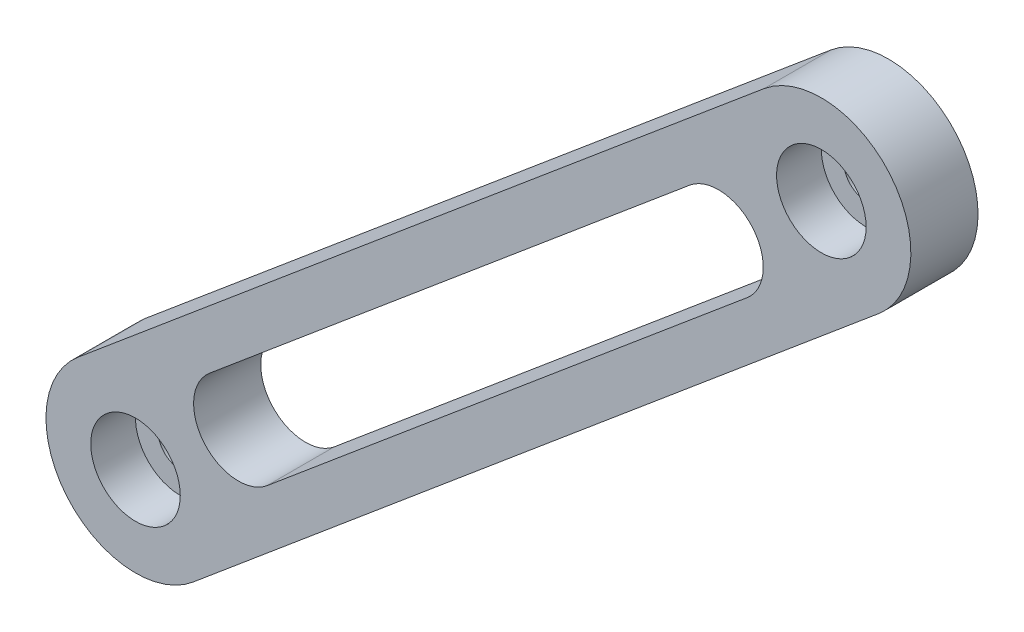
ISO-10303-21;
HEADER;
FILE_DESCRIPTION(('STEP AP214'),'2;1');
FILE_NAME('part.step','',(''),(''),'','','');
FILE_SCHEMA(('AUTOMOTIVE_DESIGN { 1 0 10303 214 1 1 1 1 }'));
ENDSEC;
DATA;
#1=APPLICATION_CONTEXT('core data for automotive mechanical design processes');
#2=APPLICATION_PROTOCOL_DEFINITION('international standard','automotive_design',2000,#1);
#3=PRODUCT_CONTEXT('',#1,'mechanical');
#4=PRODUCT('Part','Part','',(#3));
#5=PRODUCT_RELATED_PRODUCT_CATEGORY('part','',(#4));
#6=PRODUCT_DEFINITION_FORMATION('','',#4);
#7=PRODUCT_DEFINITION_CONTEXT('part definition',#1,'design');
#8=PRODUCT_DEFINITION('design','',#6,#7);
#9=PRODUCT_DEFINITION_SHAPE('','',#8);
#10=(LENGTH_UNIT() NAMED_UNIT(*) SI_UNIT(.MILLI.,.METRE.));
#11=(NAMED_UNIT(*) PLANE_ANGLE_UNIT() SI_UNIT($,.RADIAN.));
#12=(NAMED_UNIT(*) SI_UNIT($,.STERADIAN.) SOLID_ANGLE_UNIT());
#13=UNCERTAINTY_MEASURE_WITH_UNIT(LENGTH_MEASURE(1.E-05),#10,'distance_accuracy_value','');
#14=(GEOMETRIC_REPRESENTATION_CONTEXT(3) GLOBAL_UNCERTAINTY_ASSIGNED_CONTEXT((#13)) GLOBAL_UNIT_ASSIGNED_CONTEXT((#10,
#11,#12)) REPRESENTATION_CONTEXT('',''));
#15=CARTESIAN_POINT('',(0.,0.,0.));
#16=DIRECTION('',(0.,0.,1.));
#17=DIRECTION('',(1.,0.,0.));
#18=AXIS2_PLACEMENT_3D('',#15,#16,#17);
#19=CARTESIAN_POINT('',(476.682680860987,393.18542537645,19.05));
#20=DIRECTION('',(0.,0.,-1.));
#21=DIRECTION('',(-1.,0.,0.));
#22=AXIS2_PLACEMENT_3D('',#19,#20,#21);
#23=CYLINDRICAL_SURFACE('',#22,6.34999999999999);
#24=CARTESIAN_POINT('',(476.682680860987,393.18542537645,0.));
#25=DIRECTION('',(0.,0.,1.));
#26=DIRECTION('',(1.,0.,0.));
#27=AXIS2_PLACEMENT_3D('',#24,#25,#26);
#28=CIRCLE('',#27,6.34999999999999);
#29=CARTESIAN_POINT('',(470.332680860987,393.18542537645,0.));
#30=VERTEX_POINT('',#29);
#31=EDGE_CURVE('E116',#30,#30,#28,.T.);
#32=CARTESIAN_POINT('',(476.682680860987,393.18542537645,6.35));
#33=DIRECTION('',(0.,0.,1.));
#34=DIRECTION('',(1.,0.,0.));
#35=AXIS2_PLACEMENT_3D('',#32,#33,#34);
#36=CIRCLE('',#35,6.34999999999999);
#37=CARTESIAN_POINT('',(470.332680860987,393.18542537645,6.35));
#38=VERTEX_POINT('',#37);
#39=EDGE_CURVE('E37',#38,#38,#36,.T.);
#40=CARTESIAN_POINT('',(470.332680860987,393.18542537645,0.));
#41=CARTESIAN_POINT('',(470.332680860987,393.18542537645,0.0661458333333329));
#42=CARTESIAN_POINT('',(470.332680860987,393.18542537645,0.132291666666666));
#43=CARTESIAN_POINT('',(470.332680860987,393.18542537645,0.264583333333333));
#44=CARTESIAN_POINT('',(470.332680860987,393.18542537645,0.330729166666667));
#45=CARTESIAN_POINT('',(470.332680860987,393.18542537645,0.463020833333334));
#46=CARTESIAN_POINT('',(470.332680860987,393.18542537645,0.529166666666667));
#47=CARTESIAN_POINT('',(470.332680860987,393.18542537645,0.661458333333333));
#48=CARTESIAN_POINT('',(470.332680860987,393.18542537645,0.727604166666666));
#49=CARTESIAN_POINT('',(470.332680860987,393.18542537645,0.859895833333334));
#50=CARTESIAN_POINT('',(470.332680860987,393.18542537645,0.926041666666668));
#51=CARTESIAN_POINT('',(470.332680860987,393.18542537645,1.05833333333333));
#52=CARTESIAN_POINT('',(470.332680860987,393.18542537645,1.12447916666667));
#53=CARTESIAN_POINT('',(470.332680860987,393.18542537645,1.25677083333333));
#54=CARTESIAN_POINT('',(470.332680860987,393.18542537645,1.32291666666667));
#55=CARTESIAN_POINT('',(470.332680860987,393.18542537645,1.45520833333333));
#56=CARTESIAN_POINT('',(470.332680860987,393.18542537645,1.52135416666667));
#57=CARTESIAN_POINT('',(470.332680860987,393.18542537645,1.65364583333333));
#58=CARTESIAN_POINT('',(470.332680860987,393.18542537645,1.71979166666667));
#59=CARTESIAN_POINT('',(470.332680860987,393.18542537645,1.85208333333333));
#60=CARTESIAN_POINT('',(470.332680860987,393.18542537645,1.91822916666667));
#61=CARTESIAN_POINT('',(470.332680860987,393.18542537645,2.05052083333333));
#62=CARTESIAN_POINT('',(470.332680860987,393.18542537645,2.11666666666667));
#63=CARTESIAN_POINT('',(470.332680860987,393.18542537645,2.24895833333333));
#64=CARTESIAN_POINT('',(470.332680860987,393.18542537645,2.31510416666667));
#65=CARTESIAN_POINT('',(470.332680860987,393.18542537645,2.44739583333333));
#66=CARTESIAN_POINT('',(470.332680860987,393.18542537645,2.51354166666667));
#67=CARTESIAN_POINT('',(470.332680860987,393.18542537645,2.64583333333333));
#68=CARTESIAN_POINT('',(470.332680860987,393.18542537645,2.71197916666667));
#69=CARTESIAN_POINT('',(470.332680860987,393.18542537645,2.84427083333333));
#70=CARTESIAN_POINT('',(470.332680860987,393.18542537645,2.91041666666667));
#71=CARTESIAN_POINT('',(470.332680860987,393.18542537645,3.04270833333333));
#72=CARTESIAN_POINT('',(470.332680860987,393.18542537645,3.10885416666667));
#73=CARTESIAN_POINT('',(470.332680860987,393.18542537645,3.24114583333333));
#74=CARTESIAN_POINT('',(470.332680860987,393.18542537645,3.30729166666667));
#75=CARTESIAN_POINT('',(470.332680860987,393.18542537645,3.43958333333333));
#76=CARTESIAN_POINT('',(470.332680860987,393.18542537645,3.50572916666667));
#77=CARTESIAN_POINT('',(470.332680860987,393.18542537645,3.63802083333333));
#78=CARTESIAN_POINT('',(470.332680860987,393.18542537645,3.70416666666667));
#79=CARTESIAN_POINT('',(470.332680860987,393.18542537645,3.83645833333333));
#80=CARTESIAN_POINT('',(470.332680860987,393.18542537645,3.90260416666667));
#81=CARTESIAN_POINT('',(470.332680860987,393.18542537645,4.03489583333333));
#82=CARTESIAN_POINT('',(470.332680860987,393.18542537645,4.10104166666667));
#83=CARTESIAN_POINT('',(470.332680860987,393.18542537645,4.23333333333333));
#84=CARTESIAN_POINT('',(470.332680860987,393.18542537645,4.29947916666667));
#85=CARTESIAN_POINT('',(470.332680860987,393.18542537645,4.43177083333333));
#86=CARTESIAN_POINT('',(470.332680860987,393.18542537645,4.49791666666667));
#87=CARTESIAN_POINT('',(470.332680860987,393.18542537645,4.63020833333333));
#88=CARTESIAN_POINT('',(470.332680860987,393.18542537645,4.69635416666667));
#89=CARTESIAN_POINT('',(470.332680860987,393.18542537645,4.82864583333333));
#90=CARTESIAN_POINT('',(470.332680860987,393.18542537645,4.89479166666667));
#91=CARTESIAN_POINT('',(470.332680860987,393.18542537645,5.02708333333333));
#92=CARTESIAN_POINT('',(470.332680860987,393.18542537645,5.09322916666667));
#93=CARTESIAN_POINT('',(470.332680860987,393.18542537645,5.22552083333333));
#94=CARTESIAN_POINT('',(470.332680860987,393.18542537645,5.29166666666667));
#95=CARTESIAN_POINT('',(470.332680860987,393.18542537645,5.42395833333333));
#96=CARTESIAN_POINT('',(470.332680860987,393.18542537645,5.49010416666667));
#97=CARTESIAN_POINT('',(470.332680860987,393.18542537645,5.62239583333333));
#98=CARTESIAN_POINT('',(470.332680860987,393.18542537645,5.68854166666667));
#99=CARTESIAN_POINT('',(470.332680860987,393.18542537645,5.82083333333333));
#100=CARTESIAN_POINT('',(470.332680860987,393.18542537645,5.88697916666667));
#101=CARTESIAN_POINT('',(470.332680860987,393.18542537645,6.01927083333333));
#102=CARTESIAN_POINT('',(470.332680860987,393.18542537645,6.08541666666667));
#103=CARTESIAN_POINT('',(470.332680860987,393.18542537645,6.21770833333333));
#104=CARTESIAN_POINT('',(470.332680860987,393.18542537645,6.28385416666667));
#105=CARTESIAN_POINT('',(470.332680860987,393.18542537645,6.35));
#106=B_SPLINE_CURVE_WITH_KNOTS('',3,(#40,#41,#42,#43,#44,#45,#46,#47,#48,#49,#50,#51,#52,#53,
#54,#55,#56,#57,#58,#59,#60,#61,#62,#63,#64,#65,#66,#67,#68,#69,#70,#71,#72,#73,#74,#75,#76,#77,
#78,#79,#80,#81,#82,#83,#84,#85,#86,#87,#88,#89,#90,#91,#92,#93,#94,#95,#96,#97,#98,#99,#100,
#101,#102,#103,#104,#105),.UNSPECIFIED.,.F.,.F.,(4,2,2,2,2,2,2,2,2,2,2,2,2,2,2,2,2,2,2,2,2,2,2,
2,2,2,2,2,2,2,2,2,4),(0.,0.198437499999999,0.396875000000001,0.5953125,0.793749999999999,
0.992187500000002,1.190625,1.3890625,1.5875,1.7859375,1.984375,2.1828125,2.38125,2.5796875,
2.778125,2.9765625,3.175,3.3734375,3.571875,3.7703125,3.96875,4.1671875,4.365625,4.5640625,
4.7625,4.9609375,5.159375,5.3578125,5.55625,5.7546875,5.953125,6.1515625,6.35),.UNSPECIFIED.);
#107=EDGE_CURVE('BSEAM33',#30,#38,#106,.T.);
#108=ORIENTED_EDGE('',*,*,#31,.F.);
#109=ORIENTED_EDGE('',*,*,#39,.T.);
#110=ORIENTED_EDGE('',*,*,#107,.T.);
#111=ORIENTED_EDGE('',*,*,#107,.F.);
#112=EDGE_LOOP('',(#108,#110,#109,#111));
#113=FACE_BOUND('',#112,.T.);
#114=ADVANCED_FACE('F33',(#113),#23,.F.);
#115=CARTESIAN_POINT('',(282.107391364424,229.917371723671,19.05));
#116=DIRECTION('',(0.,0.,-1.));
#117=DIRECTION('',(-1.,0.,0.));
#118=AXIS2_PLACEMENT_3D('',#115,#116,#117);
#119=CYLINDRICAL_SURFACE('',#118,6.34999999999988);
#120=CARTESIAN_POINT('',(282.107391364424,229.917371723671,0.));
#121=DIRECTION('',(0.,0.,1.));
#122=DIRECTION('',(1.,0.,0.));
#123=AXIS2_PLACEMENT_3D('',#120,#121,#122);
#124=CIRCLE('',#123,6.34999999999988);
#125=CARTESIAN_POINT('',(275.757391364425,229.917371723671,0.));
#126=VERTEX_POINT('',#125);
#127=EDGE_CURVE('E130',#126,#126,#124,.T.);
#128=CARTESIAN_POINT('',(282.107391364424,229.917371723671,6.35));
#129=DIRECTION('',(0.,0.,1.));
#130=DIRECTION('',(1.,0.,0.));
#131=AXIS2_PLACEMENT_3D('',#128,#129,#130);
#132=CIRCLE('',#131,6.34999999999988);
#133=CARTESIAN_POINT('',(275.757391364425,229.917371723671,6.35));
#134=VERTEX_POINT('',#133);
#135=EDGE_CURVE('E167',#134,#134,#132,.T.);
#136=CARTESIAN_POINT('',(275.757391364425,229.917371723671,0.));
#137=CARTESIAN_POINT('',(275.757391364425,229.917371723671,0.0661458333333329));
#138=CARTESIAN_POINT('',(275.757391364425,229.917371723671,0.132291666666666));
#139=CARTESIAN_POINT('',(275.757391364425,229.917371723671,0.264583333333333));
#140=CARTESIAN_POINT('',(275.757391364425,229.917371723671,0.330729166666667));
#141=CARTESIAN_POINT('',(275.757391364425,229.917371723671,0.463020833333334));
#142=CARTESIAN_POINT('',(275.757391364425,229.917371723671,0.529166666666667));
#143=CARTESIAN_POINT('',(275.757391364425,229.917371723671,0.661458333333333));
#144=CARTESIAN_POINT('',(275.757391364425,229.917371723671,0.727604166666666));
#145=CARTESIAN_POINT('',(275.757391364425,229.917371723671,0.859895833333334));
#146=CARTESIAN_POINT('',(275.757391364425,229.917371723671,0.926041666666668));
#147=CARTESIAN_POINT('',(275.757391364425,229.917371723671,1.05833333333333));
#148=CARTESIAN_POINT('',(275.757391364425,229.917371723671,1.12447916666667));
#149=CARTESIAN_POINT('',(275.757391364425,229.917371723671,1.25677083333333));
#150=CARTESIAN_POINT('',(275.757391364425,229.917371723671,1.32291666666667));
#151=CARTESIAN_POINT('',(275.757391364425,229.917371723671,1.45520833333333));
#152=CARTESIAN_POINT('',(275.757391364425,229.917371723671,1.52135416666667));
#153=CARTESIAN_POINT('',(275.757391364425,229.917371723671,1.65364583333333));
#154=CARTESIAN_POINT('',(275.757391364425,229.917371723671,1.71979166666667));
#155=CARTESIAN_POINT('',(275.757391364425,229.917371723671,1.85208333333333));
#156=CARTESIAN_POINT('',(275.757391364425,229.917371723671,1.91822916666667));
#157=CARTESIAN_POINT('',(275.757391364425,229.917371723671,2.05052083333333));
#158=CARTESIAN_POINT('',(275.757391364425,229.917371723671,2.11666666666667));
#159=CARTESIAN_POINT('',(275.757391364425,229.917371723671,2.24895833333333));
#160=CARTESIAN_POINT('',(275.757391364425,229.917371723671,2.31510416666667));
#161=CARTESIAN_POINT('',(275.757391364425,229.917371723671,2.44739583333333));
#162=CARTESIAN_POINT('',(275.757391364425,229.917371723671,2.51354166666667));
#163=CARTESIAN_POINT('',(275.757391364425,229.917371723671,2.64583333333333));
#164=CARTESIAN_POINT('',(275.757391364425,229.917371723671,2.71197916666667));
#165=CARTESIAN_POINT('',(275.757391364425,229.917371723671,2.84427083333333));
#166=CARTESIAN_POINT('',(275.757391364425,229.917371723671,2.91041666666667));
#167=CARTESIAN_POINT('',(275.757391364425,229.917371723671,3.04270833333333));
#168=CARTESIAN_POINT('',(275.757391364425,229.917371723671,3.10885416666667));
#169=CARTESIAN_POINT('',(275.757391364425,229.917371723671,3.24114583333333));
#170=CARTESIAN_POINT('',(275.757391364425,229.917371723671,3.30729166666667));
#171=CARTESIAN_POINT('',(275.757391364425,229.917371723671,3.43958333333333));
#172=CARTESIAN_POINT('',(275.757391364425,229.917371723671,3.50572916666667));
#173=CARTESIAN_POINT('',(275.757391364425,229.917371723671,3.63802083333333));
#174=CARTESIAN_POINT('',(275.757391364425,229.917371723671,3.70416666666667));
#175=CARTESIAN_POINT('',(275.757391364425,229.917371723671,3.83645833333333));
#176=CARTESIAN_POINT('',(275.757391364425,229.917371723671,3.90260416666667));
#177=CARTESIAN_POINT('',(275.757391364425,229.917371723671,4.03489583333333));
#178=CARTESIAN_POINT('',(275.757391364425,229.917371723671,4.10104166666667));
#179=CARTESIAN_POINT('',(275.757391364425,229.917371723671,4.23333333333333));
#180=CARTESIAN_POINT('',(275.757391364425,229.917371723671,4.29947916666667));
#181=CARTESIAN_POINT('',(275.757391364425,229.917371723671,4.43177083333333));
#182=CARTESIAN_POINT('',(275.757391364425,229.917371723671,4.49791666666667));
#183=CARTESIAN_POINT('',(275.757391364425,229.917371723671,4.63020833333333));
#184=CARTESIAN_POINT('',(275.757391364425,229.917371723671,4.69635416666667));
#185=CARTESIAN_POINT('',(275.757391364425,229.917371723671,4.82864583333333));
#186=CARTESIAN_POINT('',(275.757391364425,229.917371723671,4.89479166666667));
#187=CARTESIAN_POINT('',(275.757391364425,229.917371723671,5.02708333333333));
#188=CARTESIAN_POINT('',(275.757391364425,229.917371723671,5.09322916666667));
#189=CARTESIAN_POINT('',(275.757391364425,229.917371723671,5.22552083333333));
#190=CARTESIAN_POINT('',(275.757391364425,229.917371723671,5.29166666666667));
#191=CARTESIAN_POINT('',(275.757391364425,229.917371723671,5.42395833333333));
#192=CARTESIAN_POINT('',(275.757391364425,229.917371723671,5.49010416666667));
#193=CARTESIAN_POINT('',(275.757391364425,229.917371723671,5.62239583333333));
#194=CARTESIAN_POINT('',(275.757391364425,229.917371723671,5.68854166666667));
#195=CARTESIAN_POINT('',(275.757391364425,229.917371723671,5.82083333333333));
#196=CARTESIAN_POINT('',(275.757391364425,229.917371723671,5.88697916666667));
#197=CARTESIAN_POINT('',(275.757391364425,229.917371723671,6.01927083333333));
#198=CARTESIAN_POINT('',(275.757391364425,229.917371723671,6.08541666666667));
#199=CARTESIAN_POINT('',(275.757391364425,229.917371723671,6.21770833333333));
#200=CARTESIAN_POINT('',(275.757391364425,229.917371723671,6.28385416666667));
#201=CARTESIAN_POINT('',(275.757391364425,229.917371723671,6.35));
#202=B_SPLINE_CURVE_WITH_KNOTS('',3,(#136,#137,#138,#139,#140,#141,#142,#143,#144,#145,#146,
#147,#148,#149,#150,#151,#152,#153,#154,#155,#156,#157,#158,#159,#160,#161,#162,#163,#164,#165,
#166,#167,#168,#169,#170,#171,#172,#173,#174,#175,#176,#177,#178,#179,#180,#181,#182,#183,#184,
#185,#186,#187,#188,#189,#190,#191,#192,#193,#194,#195,#196,#197,#198,#199,#200,#201),
.UNSPECIFIED.,.F.,.F.,(4,2,2,2,2,2,2,2,2,2,2,2,2,2,2,2,2,2,2,2,2,2,2,2,2,2,2,2,2,2,2,2,4),(0.,
0.198437499999999,0.396875000000001,0.5953125,0.793749999999999,0.992187500000002,1.190625,
1.3890625,1.5875,1.7859375,1.984375,2.1828125,2.38125,2.5796875,2.778125,2.9765625,3.175,
3.3734375,3.571875,3.7703125,3.96875,4.1671875,4.365625,4.5640625,4.7625,4.9609375,5.159375,
5.3578125,5.55625,5.7546875,5.953125,6.1515625,6.35),.UNSPECIFIED.);
#203=EDGE_CURVE('BSEAM191',#126,#134,#202,.T.);
#204=ORIENTED_EDGE('',*,*,#127,.F.);
#205=ORIENTED_EDGE('',*,*,#135,.T.);
#206=ORIENTED_EDGE('',*,*,#203,.T.);
#207=ORIENTED_EDGE('',*,*,#203,.F.);
#208=EDGE_LOOP('',(#204,#206,#205,#207));
#209=FACE_BOUND('',#208,.T.);
#210=ADVANCED_FACE('F191',(#209),#119,.F.);
#211=CARTESIAN_POINT('',(282.107392308767,229.917372516069,19.05));
#212=DIRECTION('',(0.,0.,1.));
#213=DIRECTION('',(1.,0.,0.));
#214=AXIS2_PLACEMENT_3D('',#211,#212,#213);
#215=PLANE('',#214);
#216=CARTESIAN_POINT('',(282.107391364424,229.917371723671,19.05));
#217=DIRECTION('',(0.,0.,1.));
#218=DIRECTION('',(1.,0.,0.));
#219=AXIS2_PLACEMENT_3D('',#216,#217,#218);
#220=CIRCLE('',#219,12.7);
#221=CARTESIAN_POINT('',(294.807391364424,229.917371723671,19.05));
#222=VERTEX_POINT('',#221);
#223=EDGE_CURVE('E174',#222,#222,#220,.T.);
#224=ORIENTED_EDGE('',*,*,#223,.F.);
#225=EDGE_LOOP('',(#224));
#226=FACE_BOUND('',#225,.T.);
#227=CARTESIAN_POINT('',(476.682680860987,393.18542537645,19.05));
#228=DIRECTION('',(0.,0.,1.));
#229=DIRECTION('',(1.,0.,0.));
#230=AXIS2_PLACEMENT_3D('',#227,#228,#229);
#231=CIRCLE('',#230,12.7);
#232=CARTESIAN_POINT('',(489.382680860987,393.18542537645,19.05));
#233=VERTEX_POINT('',#232);
#234=EDGE_CURVE('E184',#233,#233,#231,.T.);
#235=ORIENTED_EDGE('',*,*,#234,.F.);
#236=EDGE_LOOP('',(#235));
#237=FACE_BOUND('',#236,.T.);
#238=DIRECTION('',(-0.766044443118976,-0.642787609686541,0.));
#239=VECTOR('',#238,1.);
#240=CARTESIAN_POINT('',(439.332984935135,378.423981875004,19.05));
#241=LINE('',#240,#239);
#242=CARTESIAN_POINT('',(439.332984935135,378.423981875004,19.05));
#243=VERTEX_POINT('',#242);
#244=CARTESIAN_POINT('',(303.130282948581,264.136344872737,19.05));
#245=VERTEX_POINT('',#244);
#246=EDGE_CURVE('E108',#243,#245,#241,.T.);
#247=ORIENTED_EDGE('',*,*,#246,.F.);
#248=CARTESIAN_POINT('',(447.496387578154,368.695217447393,19.05));
#249=DIRECTION('',(0.,0.,1.));
#250=DIRECTION('',(1.,0.,0.));
#251=AXIS2_PLACEMENT_3D('',#248,#249,#250);
#252=CIRCLE('',#251,12.7);
#253=CARTESIAN_POINT('',(455.659790221174,358.966453019782,19.05));
#254=VERTEX_POINT('',#253);
#255=EDGE_CURVE('E100',#254,#243,#252,.T.);
#256=ORIENTED_EDGE('',*,*,#255,.F.);
#257=DIRECTION('',(0.766044443118977,0.642787609686541,0.));
#258=VECTOR('',#257,1.);
#259=CARTESIAN_POINT('',(455.659790221174,358.966453019782,19.05));
#260=LINE('',#259,#258);
#261=CARTESIAN_POINT('',(319.45708823462,244.678816017515,19.05));
#262=VERTEX_POINT('',#261);
#263=EDGE_CURVE('E124',#262,#254,#260,.T.);
#264=ORIENTED_EDGE('',*,*,#263,.F.);
#265=CARTESIAN_POINT('',(311.2936855916,254.407580445126,19.05));
#266=DIRECTION('',(0.,0.,1.));
#267=DIRECTION('',(1.,0.,0.));
#268=AXIS2_PLACEMENT_3D('',#265,#266,#267);
#269=CIRCLE('',#268,12.7);
#270=EDGE_CURVE('E122',#245,#262,#269,.T.);
#271=ORIENTED_EDGE('',*,*,#270,.F.);
#272=EDGE_LOOP('',(#247,#256,#264,#271));
#273=FACE_BOUND('',#272,.T.);
#274=CARTESIAN_POINT('',(282.107392308767,229.917372516069,19.05));
#275=DIRECTION('',(0.,0.,1.));
#276=DIRECTION('',(1.,0.,0.));
#277=AXIS2_PLACEMENT_3D('',#274,#275,#276);
#278=CIRCLE('',#277,25.4000000000003);
#279=CARTESIAN_POINT('',(265.780587022729,249.374901371292,19.05));
#280=VERTEX_POINT('',#279);
#281=CARTESIAN_POINT('',(298.434195706119,210.459842076052,19.05));
#282=VERTEX_POINT('',#281);
#283=EDGE_CURVE('E143',#280,#282,#278,.T.);
#284=ORIENTED_EDGE('',*,*,#283,.T.);
#285=DIRECTION('',(0.766044443118977,0.64278760968654,0.));
#286=VECTOR('',#285,1.);
#287=CARTESIAN_POINT('',(493.009486147026,373.727896521228,19.05));
#288=LINE('',#287,#286);
#289=CARTESIAN_POINT('',(493.009486147026,373.727896521228,19.05));
#290=VERTEX_POINT('',#289);
#291=EDGE_CURVE('E146',#282,#290,#288,.T.);
#292=ORIENTED_EDGE('',*,*,#291,.T.);
#293=CARTESIAN_POINT('',(476.682680860987,393.18542537645,19.05));
#294=DIRECTION('',(0.,0.,1.));
#295=DIRECTION('',(-1.,0.,0.));
#296=AXIS2_PLACEMENT_3D('',#293,#294,#295);
#297=CIRCLE('',#296,25.4000000000001);
#298=CARTESIAN_POINT('',(460.355875574949,412.642954231673,19.05));
#299=VERTEX_POINT('',#298);
#300=EDGE_CURVE('E149',#290,#299,#297,.T.);
#301=ORIENTED_EDGE('',*,*,#300,.T.);
#302=DIRECTION('',(-0.766044443118978,-0.642787609686539,0.));
#303=VECTOR('',#302,1.);
#304=CARTESIAN_POINT('',(460.355875574949,412.642954231673,19.05));
#305=LINE('',#304,#303);
#306=EDGE_CURVE('E151',#299,#280,#305,.T.);
#307=ORIENTED_EDGE('',*,*,#306,.T.);
#308=EDGE_LOOP('',(#284,#292,#301,#307));
#309=FACE_BOUND('',#308,.T.);
#310=ADVANCED_FACE('F120',(#226,#237,#273,#309),#215,.T.);
#311=CARTESIAN_POINT('',(282.107392308767,229.917372516069,0.));
#312=DIRECTION('',(0.,0.,1.));
#313=DIRECTION('',(1.,0.,0.));
#314=AXIS2_PLACEMENT_3D('',#311,#312,#313);
#315=PLANE('',#314);
#316=ORIENTED_EDGE('',*,*,#31,.T.);
#317=EDGE_LOOP('',(#316));
#318=FACE_BOUND('',#317,.T.);
#319=CARTESIAN_POINT('',(282.107392308767,229.917372516069,0.));
#320=DIRECTION('',(0.,0.,1.));
#321=DIRECTION('',(1.,0.,0.));
#322=AXIS2_PLACEMENT_3D('',#319,#320,#321);
#323=CIRCLE('',#322,25.4000000000003);
#324=CARTESIAN_POINT('',(265.780587022729,249.374901371292,0.));
#325=VERTEX_POINT('',#324);
#326=CARTESIAN_POINT('',(298.434195706119,210.459842076052,0.));
#327=VERTEX_POINT('',#326);
#328=EDGE_CURVE('E142',#325,#327,#323,.T.);
#329=ORIENTED_EDGE('',*,*,#328,.F.);
#330=DIRECTION('',(-0.766044443118978,-0.642787609686539,0.));
#331=VECTOR('',#330,1.);
#332=CARTESIAN_POINT('',(460.355875574949,412.642954231673,0.));
#333=LINE('',#332,#331);
#334=CARTESIAN_POINT('',(460.355875574949,412.642954231673,0.));
#335=VERTEX_POINT('',#334);
#336=EDGE_CURVE('E147',#335,#325,#333,.T.);
#337=ORIENTED_EDGE('',*,*,#336,.F.);
#338=CARTESIAN_POINT('',(476.682680860987,393.18542537645,0.));
#339=DIRECTION('',(0.,0.,1.));
#340=DIRECTION('',(-1.,0.,0.));
#341=AXIS2_PLACEMENT_3D('',#338,#339,#340);
#342=CIRCLE('',#341,25.4000000000001);
#343=CARTESIAN_POINT('',(493.009486147026,373.727896521228,0.));
#344=VERTEX_POINT('',#343);
#345=EDGE_CURVE('E158',#344,#335,#342,.T.);
#346=ORIENTED_EDGE('',*,*,#345,.F.);
#347=DIRECTION('',(0.766044443118977,0.64278760968654,0.));
#348=VECTOR('',#347,1.);
#349=CARTESIAN_POINT('',(493.009486147026,373.727896521228,0.));
#350=LINE('',#349,#348);
#351=EDGE_CURVE('E156',#327,#344,#350,.T.);
#352=ORIENTED_EDGE('',*,*,#351,.F.);
#353=EDGE_LOOP('',(#329,#337,#346,#352));
#354=FACE_BOUND('',#353,.T.);
#355=CARTESIAN_POINT('',(447.496387578154,368.695217447393,0.));
#356=DIRECTION('',(0.,0.,1.));
#357=DIRECTION('',(1.,0.,0.));
#358=AXIS2_PLACEMENT_3D('',#355,#356,#357);
#359=CIRCLE('',#358,12.7);
#360=CARTESIAN_POINT('',(455.659790221174,358.966453019782,0.));
#361=VERTEX_POINT('',#360);
#362=CARTESIAN_POINT('',(439.332984935135,378.423981875004,0.));
#363=VERTEX_POINT('',#362);
#364=EDGE_CURVE('E58',#361,#363,#359,.T.);
#365=ORIENTED_EDGE('',*,*,#364,.T.);
#366=DIRECTION('',(-0.766044443118976,-0.642787609686541,0.));
#367=VECTOR('',#366,1.);
#368=CARTESIAN_POINT('',(439.332984935135,378.423981875004,0.));
#369=LINE('',#368,#367);
#370=CARTESIAN_POINT('',(303.130282948581,264.136344872737,0.));
#371=VERTEX_POINT('',#370);
#372=EDGE_CURVE('E115',#363,#371,#369,.T.);
#373=ORIENTED_EDGE('',*,*,#372,.T.);
#374=CARTESIAN_POINT('',(311.2936855916,254.407580445126,0.));
#375=DIRECTION('',(0.,0.,1.));
#376=DIRECTION('',(1.,0.,0.));
#377=AXIS2_PLACEMENT_3D('',#374,#375,#376);
#378=CIRCLE('',#377,12.7);
#379=CARTESIAN_POINT('',(319.45708823462,244.678816017515,0.));
#380=VERTEX_POINT('',#379);
#381=EDGE_CURVE('E132',#371,#380,#378,.T.);
#382=ORIENTED_EDGE('',*,*,#381,.T.);
#383=DIRECTION('',(0.766044443118977,0.642787609686541,0.));
#384=VECTOR('',#383,1.);
#385=CARTESIAN_POINT('',(455.659790221174,358.966453019782,0.));
#386=LINE('',#385,#384);
#387=EDGE_CURVE('E109',#380,#361,#386,.T.);
#388=ORIENTED_EDGE('',*,*,#387,.T.);
#389=EDGE_LOOP('',(#365,#373,#382,#388));
#390=FACE_BOUND('',#389,.T.);
#391=ORIENTED_EDGE('',*,*,#127,.T.);
#392=EDGE_LOOP('',(#391));
#393=FACE_BOUND('',#392,.T.);
#394=ADVANCED_FACE('F189',(#318,#354,#390,#393),#315,.F.);
#395=CARTESIAN_POINT('',(282.107392308767,229.917372516069,19.05));
#396=DIRECTION('',(0.,0.,-1.));
#397=DIRECTION('',(-1.,0.,0.));
#398=AXIS2_PLACEMENT_3D('',#395,#396,#397);
#399=CYLINDRICAL_SURFACE('',#398,25.4000000000003);
#400=ORIENTED_EDGE('',*,*,#328,.T.);
#401=DIRECTION('',(0.,0.,-1.));
#402=VECTOR('',#401,1.);
#403=CARTESIAN_POINT('',(298.434195706119,210.459842076052,19.05));
#404=LINE('',#403,#402);
#405=EDGE_CURVE('E11',#282,#327,#404,.T.);
#406=ORIENTED_EDGE('',*,*,#405,.F.);
#407=ORIENTED_EDGE('',*,*,#283,.F.);
#408=DIRECTION('',(0.,0.,-1.));
#409=VECTOR('',#408,1.);
#410=CARTESIAN_POINT('',(265.780587022729,249.374901371292,19.05));
#411=LINE('',#410,#409);
#412=EDGE_CURVE('E153',#280,#325,#411,.T.);
#413=ORIENTED_EDGE('',*,*,#412,.T.);
#414=EDGE_LOOP('',(#400,#406,#407,#413));
#415=FACE_BOUND('',#414,.T.);
#416=ADVANCED_FACE('F35',(#415),#399,.T.);
#417=CARTESIAN_POINT('',(493.009486147026,373.727896521228,19.05));
#418=DIRECTION('',(-0.64278760968654,0.766044443118978,0.));
#419=DIRECTION('',(-0.766044443118978,-0.64278760968654,0.));
#420=AXIS2_PLACEMENT_3D('',#417,#418,#419);
#421=PLANE('',#420);
#422=ORIENTED_EDGE('',*,*,#351,.T.);
#423=DIRECTION('',(0.,0.,-1.));
#424=VECTOR('',#423,1.);
#425=CARTESIAN_POINT('',(493.009486147026,373.727896521228,19.05));
#426=LINE('',#425,#424);
#427=EDGE_CURVE('E42',#290,#344,#426,.T.);
#428=ORIENTED_EDGE('',*,*,#427,.F.);
#429=ORIENTED_EDGE('',*,*,#291,.F.);
#430=ORIENTED_EDGE('',*,*,#405,.T.);
#431=EDGE_LOOP('',(#422,#428,#429,#430));
#432=FACE_BOUND('',#431,.T.);
#433=ADVANCED_FACE('F227',(#432),#421,.F.);
#434=CARTESIAN_POINT('',(476.682680860987,393.18542537645,19.05));
#435=DIRECTION('',(0.,0.,-1.));
#436=DIRECTION('',(-1.,0.,0.));
#437=AXIS2_PLACEMENT_3D('',#434,#435,#436);
#438=CYLINDRICAL_SURFACE('',#437,25.4000000000001);
#439=ORIENTED_EDGE('',*,*,#345,.T.);
#440=DIRECTION('',(0.,0.,-1.));
#441=VECTOR('',#440,1.);
#442=CARTESIAN_POINT('',(460.355875574949,412.642954231673,19.05));
#443=LINE('',#442,#441);
#444=EDGE_CURVE('E163',#299,#335,#443,.T.);
#445=ORIENTED_EDGE('',*,*,#444,.F.);
#446=ORIENTED_EDGE('',*,*,#300,.F.);
#447=ORIENTED_EDGE('',*,*,#427,.T.);
#448=EDGE_LOOP('',(#439,#445,#446,#447));
#449=FACE_BOUND('',#448,.T.);
#450=ADVANCED_FACE('F224',(#449),#438,.T.);
#451=CARTESIAN_POINT('',(460.355875574949,412.642954231673,19.05));
#452=DIRECTION('',(0.642787609686539,-0.766044443118978,0.));
#453=DIRECTION('',(0.766044443118978,0.642787609686539,0.));
#454=AXIS2_PLACEMENT_3D('',#451,#452,#453);
#455=PLANE('',#454);
#456=ORIENTED_EDGE('',*,*,#336,.T.);
#457=ORIENTED_EDGE('',*,*,#412,.F.);
#458=ORIENTED_EDGE('',*,*,#306,.F.);
#459=ORIENTED_EDGE('',*,*,#444,.T.);
#460=EDGE_LOOP('',(#456,#457,#458,#459));
#461=FACE_BOUND('',#460,.T.);
#462=ADVANCED_FACE('F217',(#461),#455,.F.);
#463=CARTESIAN_POINT('',(447.496387578154,368.695217447393,19.05));
#464=DIRECTION('',(0.,0.,-1.));
#465=DIRECTION('',(-1.,0.,0.));
#466=AXIS2_PLACEMENT_3D('',#463,#464,#465);
#467=CYLINDRICAL_SURFACE('',#466,12.7);
#468=ORIENTED_EDGE('',*,*,#364,.F.);
#469=DIRECTION('',(0.,0.,-1.));
#470=VECTOR('',#469,1.);
#471=CARTESIAN_POINT('',(455.659790221174,358.966453019782,19.05));
#472=LINE('',#471,#470);
#473=EDGE_CURVE('E104',#254,#361,#472,.T.);
#474=ORIENTED_EDGE('',*,*,#473,.F.);
#475=ORIENTED_EDGE('',*,*,#255,.T.);
#476=DIRECTION('',(0.,0.,-1.));
#477=VECTOR('',#476,1.);
#478=CARTESIAN_POINT('',(439.332984935135,378.423981875004,19.05));
#479=LINE('',#478,#477);
#480=EDGE_CURVE('E103',#243,#363,#479,.T.);
#481=ORIENTED_EDGE('',*,*,#480,.T.);
#482=EDGE_LOOP('',(#468,#474,#475,#481));
#483=FACE_BOUND('',#482,.T.);
#484=ADVANCED_FACE('F102',(#483),#467,.F.);
#485=CARTESIAN_POINT('',(439.332984935135,378.423981875004,19.05));
#486=DIRECTION('',(0.642787609686541,-0.766044443118976,0.));
#487=DIRECTION('',(0.766044443118976,0.642787609686541,0.));
#488=AXIS2_PLACEMENT_3D('',#485,#486,#487);
#489=PLANE('',#488);
#490=ORIENTED_EDGE('',*,*,#372,.F.);
#491=ORIENTED_EDGE('',*,*,#480,.F.);
#492=ORIENTED_EDGE('',*,*,#246,.T.);
#493=DIRECTION('',(0.,0.,-1.));
#494=VECTOR('',#493,1.);
#495=CARTESIAN_POINT('',(303.130282948581,264.136344872737,19.05));
#496=LINE('',#495,#494);
#497=EDGE_CURVE('E117',#245,#371,#496,.T.);
#498=ORIENTED_EDGE('',*,*,#497,.T.);
#499=EDGE_LOOP('',(#490,#491,#492,#498));
#500=FACE_BOUND('',#499,.T.);
#501=ADVANCED_FACE('F112',(#500),#489,.T.);
#502=CARTESIAN_POINT('',(311.2936855916,254.407580445126,19.05));
#503=DIRECTION('',(0.,0.,-1.));
#504=DIRECTION('',(-1.,0.,0.));
#505=AXIS2_PLACEMENT_3D('',#502,#503,#504);
#506=CYLINDRICAL_SURFACE('',#505,12.7);
#507=ORIENTED_EDGE('',*,*,#381,.F.);
#508=ORIENTED_EDGE('',*,*,#497,.F.);
#509=ORIENTED_EDGE('',*,*,#270,.T.);
#510=DIRECTION('',(0.,0.,-1.));
#511=VECTOR('',#510,1.);
#512=CARTESIAN_POINT('',(319.45708823462,244.678816017515,19.05));
#513=LINE('',#512,#511);
#514=EDGE_CURVE('E50',#262,#380,#513,.T.);
#515=ORIENTED_EDGE('',*,*,#514,.T.);
#516=EDGE_LOOP('',(#507,#508,#509,#515));
#517=FACE_BOUND('',#516,.T.);
#518=ADVANCED_FACE('F210',(#517),#506,.F.);
#519=CARTESIAN_POINT('',(455.659790221174,358.966453019782,19.05));
#520=DIRECTION('',(-0.642787609686541,0.766044443118977,0.));
#521=DIRECTION('',(-0.766044443118977,-0.642787609686541,0.));
#522=AXIS2_PLACEMENT_3D('',#519,#520,#521);
#523=PLANE('',#522);
#524=ORIENTED_EDGE('',*,*,#387,.F.);
#525=ORIENTED_EDGE('',*,*,#514,.F.);
#526=ORIENTED_EDGE('',*,*,#263,.T.);
#527=ORIENTED_EDGE('',*,*,#473,.T.);
#528=EDGE_LOOP('',(#524,#525,#526,#527));
#529=FACE_BOUND('',#528,.T.);
#530=ADVANCED_FACE('F206',(#529),#523,.T.);
#531=CARTESIAN_POINT('',(282.107391364424,229.917371723671,6.35));
#532=DIRECTION('',(0.,0.,1.));
#533=DIRECTION('',(1.,0.,0.));
#534=AXIS2_PLACEMENT_3D('',#531,#532,#533);
#535=CYLINDRICAL_SURFACE('',#534,12.7);
#536=CARTESIAN_POINT('',(282.107391364424,229.917371723671,6.35));
#537=DIRECTION('',(0.,0.,1.));
#538=DIRECTION('',(1.,0.,0.));
#539=AXIS2_PLACEMENT_3D('',#536,#537,#538);
#540=CIRCLE('',#539,12.7);
#541=CARTESIAN_POINT('',(294.807391364424,229.917371723671,6.35));
#542=VERTEX_POINT('',#541);
#543=EDGE_CURVE('E169',#542,#542,#540,.T.);
#544=ORIENTED_EDGE('',*,*,#543,.F.);
#545=EDGE_LOOP('',(#544));
#546=FACE_BOUND('',#545,.T.);
#547=ORIENTED_EDGE('',*,*,#223,.T.);
#548=EDGE_LOOP('',(#547));
#549=FACE_BOUND('',#548,.T.);
#550=ADVANCED_FACE('F209',(#546,#549),#535,.F.);
#551=CARTESIAN_POINT('',(282.107391364424,229.917371723671,6.35));
#552=DIRECTION('',(0.,0.,1.));
#553=DIRECTION('',(1.,0.,0.));
#554=AXIS2_PLACEMENT_3D('',#551,#552,#553);
#555=PLANE('',#554);
#556=ORIENTED_EDGE('',*,*,#135,.F.);
#557=EDGE_LOOP('',(#556));
#558=FACE_BOUND('',#557,.T.);
#559=ORIENTED_EDGE('',*,*,#543,.T.);
#560=EDGE_LOOP('',(#559));
#561=FACE_BOUND('',#560,.T.);
#562=ADVANCED_FACE('F270',(#558,#561),#555,.T.);
#563=CARTESIAN_POINT('',(476.682680860987,393.18542537645,6.35));
#564=DIRECTION('',(0.,0.,1.));
#565=DIRECTION('',(1.,0.,0.));
#566=AXIS2_PLACEMENT_3D('',#563,#564,#565);
#567=CYLINDRICAL_SURFACE('',#566,12.7);
#568=CARTESIAN_POINT('',(476.682680860987,393.18542537645,6.35));
#569=DIRECTION('',(0.,0.,1.));
#570=DIRECTION('',(1.,0.,0.));
#571=AXIS2_PLACEMENT_3D('',#568,#569,#570);
#572=CIRCLE('',#571,12.7);
#573=CARTESIAN_POINT('',(489.382680860987,393.18542537645,6.35));
#574=VERTEX_POINT('',#573);
#575=EDGE_CURVE('E179',#574,#574,#572,.T.);
#576=ORIENTED_EDGE('',*,*,#575,.F.);
#577=EDGE_LOOP('',(#576));
#578=FACE_BOUND('',#577,.T.);
#579=ORIENTED_EDGE('',*,*,#234,.T.);
#580=EDGE_LOOP('',(#579));
#581=FACE_BOUND('',#580,.T.);
#582=ADVANCED_FACE('F204',(#578,#581),#567,.F.);
#583=CARTESIAN_POINT('',(476.682680860987,393.18542537645,6.35));
#584=DIRECTION('',(0.,0.,1.));
#585=DIRECTION('',(1.,0.,0.));
#586=AXIS2_PLACEMENT_3D('',#583,#584,#585);
#587=PLANE('',#586);
#588=ORIENTED_EDGE('',*,*,#39,.F.);
#589=EDGE_LOOP('',(#588));
#590=FACE_BOUND('',#589,.T.);
#591=ORIENTED_EDGE('',*,*,#575,.T.);
#592=EDGE_LOOP('',(#591));
#593=FACE_BOUND('',#592,.T.);
#594=ADVANCED_FACE('F290',(#590,#593),#587,.T.);
#595=CLOSED_SHELL('',(#114,#210,#310,#394,#416,#433,#450,#462,#484,#501,#518,#530,#550,#562,
#582,#594));
#596=MANIFOLD_SOLID_BREP('B2',#595);
#597=ADVANCED_BREP_SHAPE_REPRESENTATION('',(#18,#596),#14);
#598=SHAPE_DEFINITION_REPRESENTATION(#9,#597);
ENDSEC;
END-ISO-10303-21;
